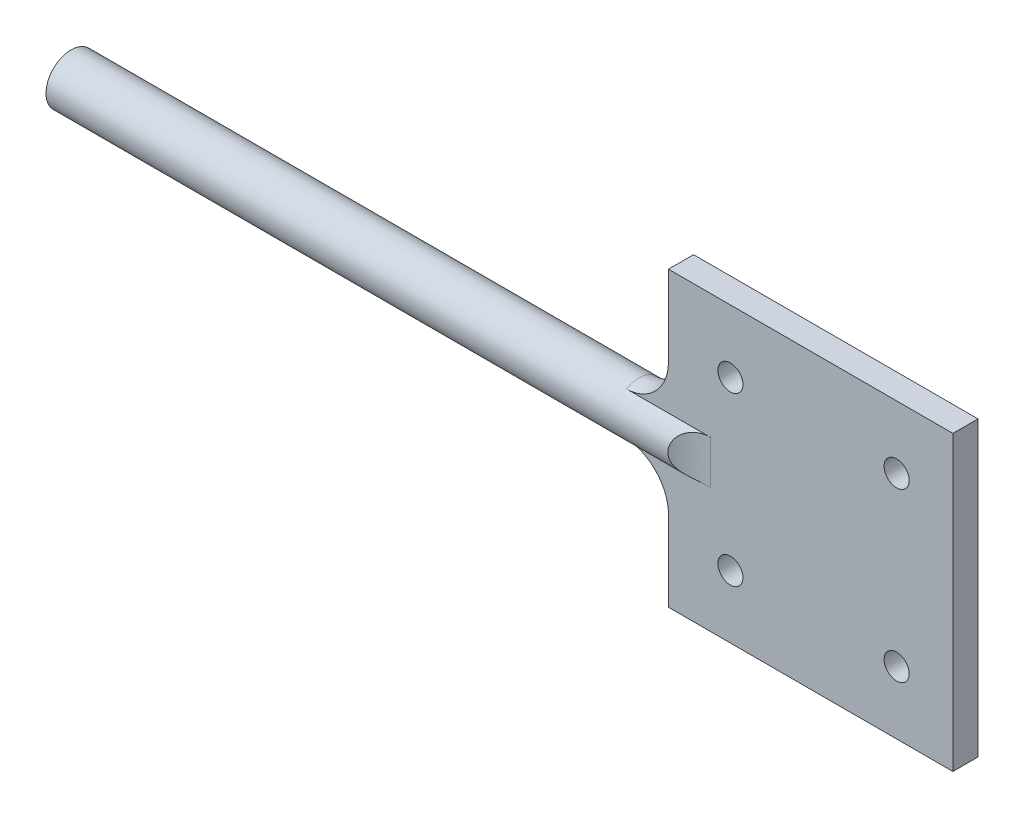
ISO-10303-21;
HEADER;
FILE_DESCRIPTION(('STEP AP214'),'2;1');
FILE_NAME('part.step','',(''),(''),'','','');
FILE_SCHEMA(('AUTOMOTIVE_DESIGN { 1 0 10303 214 1 1 1 1 }'));
ENDSEC;
DATA;
#1=APPLICATION_CONTEXT('core data for automotive mechanical design processes');
#2=APPLICATION_PROTOCOL_DEFINITION('international standard','automotive_design',2000,#1);
#3=PRODUCT_CONTEXT('',#1,'mechanical');
#4=PRODUCT('Part','Part','',(#3));
#5=PRODUCT_RELATED_PRODUCT_CATEGORY('part','',(#4));
#6=PRODUCT_DEFINITION_FORMATION('','',#4);
#7=PRODUCT_DEFINITION_CONTEXT('part definition',#1,'design');
#8=PRODUCT_DEFINITION('design','',#6,#7);
#9=PRODUCT_DEFINITION_SHAPE('','',#8);
#10=(LENGTH_UNIT() NAMED_UNIT(*) SI_UNIT(.MILLI.,.METRE.));
#11=(NAMED_UNIT(*) PLANE_ANGLE_UNIT() SI_UNIT($,.RADIAN.));
#12=(NAMED_UNIT(*) SI_UNIT($,.STERADIAN.) SOLID_ANGLE_UNIT());
#13=UNCERTAINTY_MEASURE_WITH_UNIT(LENGTH_MEASURE(1.E-05),#10,'distance_accuracy_value','');
#14=(GEOMETRIC_REPRESENTATION_CONTEXT(3) GLOBAL_UNCERTAINTY_ASSIGNED_CONTEXT((#13)) GLOBAL_UNIT_ASSIGNED_CONTEXT((#10,
#11,#12)) REPRESENTATION_CONTEXT('',''));
#15=CARTESIAN_POINT('',(0.,0.,0.));
#16=DIRECTION('',(0.,0.,1.));
#17=DIRECTION('',(1.,0.,0.));
#18=AXIS2_PLACEMENT_3D('',#15,#16,#17);
#19=CARTESIAN_POINT('',(-17.,-17.5,3.));
#20=DIRECTION('',(1.,0.,0.));
#21=DIRECTION('',(0.,0.,-1.));
#22=AXIS2_PLACEMENT_3D('',#19,#20,#21);
#23=PLANE('',#22);
#24=DIRECTION('',(0.,-1.,0.));
#25=VECTOR('',#24,1.);
#26=CARTESIAN_POINT('',(-17.,-17.5,0.));
#27=LINE('',#26,#25);
#28=CARTESIAN_POINT('',(-17.,17.5,0.));
#29=VERTEX_POINT('',#28);
#30=CARTESIAN_POINT('',(-17.,7.85811682275085,0.));
#31=VERTEX_POINT('',#30);
#32=EDGE_CURVE('E268',#29,#31,#27,.T.);
#33=ORIENTED_EDGE('',*,*,#32,.T.);
#34=CARTESIAN_POINT('',(-17.,0.,1.5));
#35=DIRECTION('',(1.,0.,0.));
#36=DIRECTION('',(0.,0.,-1.));
#37=AXIS2_PLACEMENT_3D('',#34,#35,#36);
#38=CIRCLE('',#37,8.);
#39=CARTESIAN_POINT('',(-17.,7.85811682275085,3.));
#40=VERTEX_POINT('',#39);
#41=EDGE_CURVE('E71',#31,#40,#38,.T.);
#42=ORIENTED_EDGE('',*,*,#41,.T.);
#43=DIRECTION('',(0.,-1.,0.));
#44=VECTOR('',#43,1.);
#45=CARTESIAN_POINT('',(-17.,-17.5,3.));
#46=LINE('',#45,#44);
#47=CARTESIAN_POINT('',(-17.,17.5,3.));
#48=VERTEX_POINT('',#47);
#49=EDGE_CURVE('E139',#48,#40,#46,.T.);
#50=ORIENTED_EDGE('',*,*,#49,.F.);
#51=DIRECTION('',(0.,0.,-1.));
#52=VECTOR('',#51,1.);
#53=CARTESIAN_POINT('',(-17.,17.5,3.));
#54=LINE('',#53,#52);
#55=EDGE_CURVE('E299',#48,#29,#54,.T.);
#56=ORIENTED_EDGE('',*,*,#55,.T.);
#57=EDGE_LOOP('',(#33,#42,#50,#56));
#58=FACE_BOUND('',#57,.T.);
#59=ADVANCED_FACE('F43',(#58),#23,.F.);
#60=CARTESIAN_POINT('',(-17.,-7.85811682275086,3.));
#61=VERTEX_POINT('',#60);
#62=CARTESIAN_POINT('',(-17.,-17.5,3.));
#63=VERTEX_POINT('',#62);
#64=EDGE_CURVE('E127',#61,#63,#46,.T.);
#65=ORIENTED_EDGE('',*,*,#64,.F.);
#66=CARTESIAN_POINT('',(-17.,0.,1.5));
#67=DIRECTION('',(1.,0.,0.));
#68=DIRECTION('',(0.,0.,-1.));
#69=AXIS2_PLACEMENT_3D('',#66,#67,#68);
#70=CIRCLE('',#69,8.);
#71=CARTESIAN_POINT('',(-17.,-7.85811682275086,0.));
#72=VERTEX_POINT('',#71);
#73=EDGE_CURVE('E510',#61,#72,#70,.T.);
#74=ORIENTED_EDGE('',*,*,#73,.T.);
#75=CARTESIAN_POINT('',(-17.,-17.5,0.));
#76=VERTEX_POINT('',#75);
#77=EDGE_CURVE('E154',#72,#76,#27,.T.);
#78=ORIENTED_EDGE('',*,*,#77,.T.);
#79=DIRECTION('',(0.,0.,-1.));
#80=VECTOR('',#79,1.);
#81=CARTESIAN_POINT('',(-17.,-17.5,3.));
#82=LINE('',#81,#80);
#83=EDGE_CURVE('E145',#63,#76,#82,.T.);
#84=ORIENTED_EDGE('',*,*,#83,.F.);
#85=EDGE_LOOP('',(#65,#74,#78,#84));
#86=FACE_BOUND('',#85,.T.);
#87=ADVANCED_FACE('F152',(#86),#23,.F.);
#88=CARTESIAN_POINT('',(17.,-17.5,3.));
#89=DIRECTION('',(0.,1.,0.));
#90=DIRECTION('',(0.,0.,1.));
#91=AXIS2_PLACEMENT_3D('',#88,#89,#90);
#92=PLANE('',#91);
#93=DIRECTION('',(1.,0.,0.));
#94=VECTOR('',#93,1.);
#95=CARTESIAN_POINT('',(17.,-17.5,0.));
#96=LINE('',#95,#94);
#97=CARTESIAN_POINT('',(17.,-17.5,0.));
#98=VERTEX_POINT('',#97);
#99=EDGE_CURVE('E302',#76,#98,#96,.T.);
#100=ORIENTED_EDGE('',*,*,#99,.T.);
#101=DIRECTION('',(0.,0.,-1.));
#102=VECTOR('',#101,1.);
#103=CARTESIAN_POINT('',(17.,-17.5,3.));
#104=LINE('',#103,#102);
#105=CARTESIAN_POINT('',(17.,-17.5,3.));
#106=VERTEX_POINT('',#105);
#107=EDGE_CURVE('E147',#106,#98,#104,.T.);
#108=ORIENTED_EDGE('',*,*,#107,.F.);
#109=DIRECTION('',(1.,0.,0.));
#110=VECTOR('',#109,1.);
#111=CARTESIAN_POINT('',(17.,-17.5,3.));
#112=LINE('',#111,#110);
#113=EDGE_CURVE('E131',#63,#106,#112,.T.);
#114=ORIENTED_EDGE('',*,*,#113,.F.);
#115=ORIENTED_EDGE('',*,*,#83,.T.);
#116=EDGE_LOOP('',(#100,#108,#114,#115));
#117=FACE_BOUND('',#116,.T.);
#118=ADVANCED_FACE('F144',(#117),#92,.F.);
#119=CARTESIAN_POINT('',(17.,-17.5,3.));
#120=DIRECTION('',(-1.,0.,0.));
#121=DIRECTION('',(0.,0.,1.));
#122=AXIS2_PLACEMENT_3D('',#119,#120,#121);
#123=PLANE('',#122);
#124=DIRECTION('',(0.,1.,0.));
#125=VECTOR('',#124,1.);
#126=CARTESIAN_POINT('',(17.,-17.5,0.));
#127=LINE('',#126,#125);
#128=CARTESIAN_POINT('',(17.,17.5,0.));
#129=VERTEX_POINT('',#128);
#130=EDGE_CURVE('E305',#98,#129,#127,.T.);
#131=ORIENTED_EDGE('',*,*,#130,.T.);
#132=DIRECTION('',(0.,0.,-1.));
#133=VECTOR('',#132,1.);
#134=CARTESIAN_POINT('',(17.,17.5,3.));
#135=LINE('',#134,#133);
#136=CARTESIAN_POINT('',(17.,17.5,3.));
#137=VERTEX_POINT('',#136);
#138=EDGE_CURVE('E164',#137,#129,#135,.T.);
#139=ORIENTED_EDGE('',*,*,#138,.F.);
#140=DIRECTION('',(0.,1.,0.));
#141=VECTOR('',#140,1.);
#142=CARTESIAN_POINT('',(17.,-17.5,3.));
#143=LINE('',#142,#141);
#144=EDGE_CURVE('E150',#106,#137,#143,.T.);
#145=ORIENTED_EDGE('',*,*,#144,.F.);
#146=ORIENTED_EDGE('',*,*,#107,.T.);
#147=EDGE_LOOP('',(#131,#139,#145,#146));
#148=FACE_BOUND('',#147,.T.);
#149=ADVANCED_FACE('F321',(#148),#123,.F.);
#150=CARTESIAN_POINT('',(17.,17.5,3.));
#151=DIRECTION('',(0.,-1.,0.));
#152=DIRECTION('',(1.,0.,0.));
#153=AXIS2_PLACEMENT_3D('',#150,#151,#152);
#154=PLANE('',#153);
#155=DIRECTION('',(-1.,0.,0.));
#156=VECTOR('',#155,1.);
#157=CARTESIAN_POINT('',(17.,17.5,0.));
#158=LINE('',#157,#156);
#159=EDGE_CURVE('E140',#129,#29,#158,.T.);
#160=ORIENTED_EDGE('',*,*,#159,.T.);
#161=ORIENTED_EDGE('',*,*,#55,.F.);
#162=DIRECTION('',(-1.,0.,0.));
#163=VECTOR('',#162,1.);
#164=CARTESIAN_POINT('',(17.,17.5,3.));
#165=LINE('',#164,#163);
#166=EDGE_CURVE('E297',#137,#48,#165,.T.);
#167=ORIENTED_EDGE('',*,*,#166,.F.);
#168=ORIENTED_EDGE('',*,*,#138,.T.);
#169=EDGE_LOOP('',(#160,#161,#167,#168));
#170=FACE_BOUND('',#169,.T.);
#171=ADVANCED_FACE('F242',(#170),#154,.F.);
#172=CARTESIAN_POINT('',(0.,0.,3.));
#173=DIRECTION('',(0.,0.,1.));
#174=DIRECTION('',(1.,0.,0.));
#175=AXIS2_PLACEMENT_3D('',#172,#173,#174);
#176=PLANE('',#175);
#177=CARTESIAN_POINT('',(10.2751582396487,-10.,3.));
#178=DIRECTION('',(0.,0.,1.));
#179=DIRECTION('',(1.,0.,0.));
#180=AXIS2_PLACEMENT_3D('',#177,#178,#179);
#181=CIRCLE('',#180,1.5);
#182=CARTESIAN_POINT('',(11.7751582396487,-10.,3.));
#183=VERTEX_POINT('',#182);
#184=EDGE_CURVE('E284',#183,#183,#181,.T.);
#185=ORIENTED_EDGE('',*,*,#184,.F.);
#186=EDGE_LOOP('',(#185));
#187=FACE_BOUND('',#186,.T.);
#188=CARTESIAN_POINT('',(-9.59363137479316,10.,3.));
#189=DIRECTION('',(0.,0.,1.));
#190=DIRECTION('',(1.,0.,0.));
#191=AXIS2_PLACEMENT_3D('',#188,#189,#190);
#192=CIRCLE('',#191,1.5);
#193=CARTESIAN_POINT('',(-8.09363137479316,10.,3.));
#194=VERTEX_POINT('',#193);
#195=EDGE_CURVE('E283',#194,#194,#192,.T.);
#196=ORIENTED_EDGE('',*,*,#195,.F.);
#197=EDGE_LOOP('',(#196));
#198=FACE_BOUND('',#197,.T.);
#199=CARTESIAN_POINT('',(-9.59363137479316,-10.,3.));
#200=DIRECTION('',(0.,0.,1.));
#201=DIRECTION('',(1.,0.,0.));
#202=AXIS2_PLACEMENT_3D('',#199,#200,#201);
#203=CIRCLE('',#202,1.5);
#204=CARTESIAN_POINT('',(-8.09363137479316,-10.,3.));
#205=VERTEX_POINT('',#204);
#206=EDGE_CURVE('E277',#205,#205,#203,.T.);
#207=ORIENTED_EDGE('',*,*,#206,.F.);
#208=EDGE_LOOP('',(#207));
#209=FACE_BOUND('',#208,.T.);
#210=CARTESIAN_POINT('',(10.2751582396487,10.,3.));
#211=DIRECTION('',(0.,0.,1.));
#212=DIRECTION('',(1.,0.,0.));
#213=AXIS2_PLACEMENT_3D('',#210,#211,#212);
#214=CIRCLE('',#213,1.5);
#215=CARTESIAN_POINT('',(11.7751582396487,10.,3.));
#216=VERTEX_POINT('',#215);
#217=EDGE_CURVE('E173',#216,#216,#214,.T.);
#218=ORIENTED_EDGE('',*,*,#217,.F.);
#219=EDGE_LOOP('',(#218));
#220=FACE_BOUND('',#219,.T.);
#221=DIRECTION('',(0.,-1.,0.));
#222=VECTOR('',#221,1.);
#223=CARTESIAN_POINT('',(-12.,0.,3.));
#224=LINE('',#223,#222);
#225=CARTESIAN_POINT('',(-12.,2.59807621135331,3.));
#226=VERTEX_POINT('',#225);
#227=CARTESIAN_POINT('',(-12.,-2.59807621135332,3.));
#228=VERTEX_POINT('',#227);
#229=EDGE_CURVE('E162',#226,#228,#224,.T.);
#230=ORIENTED_EDGE('',*,*,#229,.T.);
#231=DIRECTION('',(1.,0.,0.));
#232=VECTOR('',#231,1.);
#233=CARTESIAN_POINT('',(-12.,-2.59807621135332,3.));
#234=LINE('',#233,#232);
#235=CARTESIAN_POINT('',(-22.,-2.59807621135332,3.));
#236=VERTEX_POINT('',#235);
#237=EDGE_CURVE('E187',#228,#236,#234,.F.);
#238=ORIENTED_EDGE('',*,*,#237,.T.);
#239=CARTESIAN_POINT('',(-22.,-2.59807621135332,3.));
#240=CARTESIAN_POINT('',(-21.8720698590303,-2.59803434740894,3.));
#241=CARTESIAN_POINT('',(-21.7441631751176,-2.60374465449356,3.));
#242=CARTESIAN_POINT('',(-21.4894223234853,-2.62634318554361,3.));
#243=CARTESIAN_POINT('',(-21.3625875068187,-2.64322406915488,3.));
#244=CARTESIAN_POINT('',(-21.111494918928,-2.68772303440085,3.));
#245=CARTESIAN_POINT('',(-20.9872272285358,-2.71528527410251,3.));
#246=CARTESIAN_POINT('',(-20.741417959479,-2.78059800674806,3.));
#247=CARTESIAN_POINT('',(-20.6198767532492,-2.81834988251672,3.));
#248=CARTESIAN_POINT('',(-20.2636899311158,-2.94483774866838,3.));
#249=CARTESIAN_POINT('',(-20.0338478031004,-3.0474791503028,3.));
#250=CARTESIAN_POINT('',(-19.5916089121233,-3.28547979991975,3.));
#251=CARTESIAN_POINT('',(-19.3792405625467,-3.4208909776313,3.));
#252=CARTESIAN_POINT('',(-18.9490802535146,-3.74000694258217,3.));
#253=CARTESIAN_POINT('',(-18.7342499521256,-3.92772141278141,3.));
#254=CARTESIAN_POINT('',(-18.3365480794698,-4.33433574809454,3.));
#255=CARTESIAN_POINT('',(-18.1536795911206,-4.55323861783318,3.));
#256=CARTESIAN_POINT('',(-17.8126350868577,-5.03347099287463,3.));
#257=CARTESIAN_POINT('',(-17.6571355232553,-5.29670962363604,3.));
#258=CARTESIAN_POINT('',(-17.3929512931485,-5.8456561761937,3.));
#259=CARTESIAN_POINT('',(-17.284249140203,-6.13135565793577,3.));
#260=CARTESIAN_POINT('',(-17.1345640613075,-6.65712661584011,3.));
#261=CARTESIAN_POINT('',(-17.0842746390812,-6.89456914177847,3.));
#262=CARTESIAN_POINT('',(-17.033811477544,-7.25409583755924,3.));
#263=CARTESIAN_POINT('',(-17.0211522202324,-7.37452245629507,3.));
#264=CARTESIAN_POINT('',(-17.0042444352086,-7.61599309212197,3.));
#265=CARTESIAN_POINT('',(-16.9999979177925,-7.73703724985304,3.));
#266=CARTESIAN_POINT('',(-17.,-7.85811682275086,3.));
#267=B_SPLINE_CURVE_WITH_KNOTS('',3,(#239,#240,#241,#242,#243,#244,#245,#246,#247,#248,#249,
#250,#251,#252,#253,#254,#255,#256,#257,#258,#259,#260,#261,#262,#263,#264,#265,#266),
.UNSPECIFIED.,.F.,.F.,(4,2,2,2,2,2,2,2,2,2,2,2,2,4),(0.,0.383624660063179,0.766997484577274,
1.14839250840167,1.52983931698956,2.28177594498336,3.03491204855058,3.88712341820064,
4.73941694368307,5.65224764636578,6.5647369617,7.29047044826544,7.65347933390575,
8.01657495317183),.UNSPECIFIED.);
#268=EDGE_CURVE('E134',#236,#61,#267,.T.);
#269=ORIENTED_EDGE('',*,*,#268,.T.);
#270=ORIENTED_EDGE('',*,*,#64,.T.);
#271=ORIENTED_EDGE('',*,*,#113,.T.);
#272=ORIENTED_EDGE('',*,*,#144,.T.);
#273=ORIENTED_EDGE('',*,*,#166,.T.);
#274=ORIENTED_EDGE('',*,*,#49,.T.);
#275=CARTESIAN_POINT('',(-17.,7.85811682275085,3.));
#276=CARTESIAN_POINT('',(-16.9999692987539,7.68674663597396,3.));
#277=CARTESIAN_POINT('',(-17.0084987547938,7.51539417475878,3.));
#278=CARTESIAN_POINT('',(-17.0423349389988,7.17437917110647,3.));
#279=CARTESIAN_POINT('',(-17.0676389233026,7.00471635689479,3.));
#280=CARTESIAN_POINT('',(-17.1345521257779,6.66932563818923,3.));
#281=CARTESIAN_POINT('',(-17.1760981188457,6.50358508719419,3.));
#282=CARTESIAN_POINT('',(-17.2749638644063,6.17689508819653,3.));
#283=CARTESIAN_POINT('',(-17.3322817440143,6.01594507383898,3.));
#284=CARTESIAN_POINT('',(-17.4533133841518,5.72147277648576,3.));
#285=CARTESIAN_POINT('',(-17.5151360388739,5.58716870892895,3.));
#286=CARTESIAN_POINT('',(-17.6496307681134,5.3240529879333,3.));
#287=CARTESIAN_POINT('',(-17.7223062152858,5.19524305792816,3.));
#288=CARTESIAN_POINT('',(-17.8779306543871,4.94401715956082,3.));
#289=CARTESIAN_POINT('',(-17.9608774520166,4.82159983344502,3.));
#290=CARTESIAN_POINT('',(-18.1364618110889,4.58390504733365,3.));
#291=CARTESIAN_POINT('',(-18.2291027312913,4.46863008415093,3.));
#292=CARTESIAN_POINT('',(-18.5261978572783,4.12832184932962,3.));
#293=CARTESIAN_POINT('',(-18.7454356631702,3.91590555653528,3.));
#294=CARTESIAN_POINT('',(-19.2169276752085,3.53088339046573,3.));
#295=CARTESIAN_POINT('',(-19.4692114797099,3.35831359400286,3.));
#296=CARTESIAN_POINT('',(-19.8663163380417,3.13552120118883,3.));
#297=CARTESIAN_POINT('',(-20.0013323135264,3.06742975519197,3.));
#298=CARTESIAN_POINT('',(-20.2771016277977,2.94385640314973,3.));
#299=CARTESIAN_POINT('',(-20.4178558585296,2.88837646629814,3.));
#300=CARTESIAN_POINT('',(-20.7035901548799,2.79126117307103,3.));
#301=CARTESIAN_POINT('',(-20.848556116077,2.74958435598486,3.));
#302=CARTESIAN_POINT('',(-21.1418407861391,2.68085691162363,3.));
#303=CARTESIAN_POINT('',(-21.2901568030171,2.6537949474758,3.));
#304=CARTESIAN_POINT('',(-21.5323822775267,2.62234428767057,3.));
#305=CARTESIAN_POINT('',(-21.6257030262999,2.61325327456877,3.));
#306=CARTESIAN_POINT('',(-21.8126764213394,2.60111621575852,3.));
#307=CARTESIAN_POINT('',(-21.9063288183948,2.59806632409141,3.));
#308=CARTESIAN_POINT('',(-22.,2.59807621135331,3.));
#309=B_SPLINE_CURVE_WITH_KNOTS('',3,(#275,#276,#277,#278,#279,#280,#281,#282,#283,#284,#285,
#286,#287,#288,#289,#290,#291,#292,#293,#294,#295,#296,#297,#298,#299,#300,#301,#302,#303,#304,
#305,#306,#307,#308),.UNSPECIFIED.,.F.,.F.,(4,2,2,2,2,2,2,2,2,2,2,2,2,2,2,2,4),(0.,
0.513873121658802,1.0276622082409,1.53947087503994,2.05121879163288,2.49427829149356,
2.93747576584295,3.38057872141019,3.82383571208794,4.73508750304379,5.64716112955732,
6.10028247256415,6.55347451858926,7.00529268859908,7.45675987393371,7.73786703079971,
8.01879516884617),.UNSPECIFIED.);
#310=CARTESIAN_POINT('',(-22.,2.59807621135331,3.));
#311=VERTEX_POINT('',#310);
#312=EDGE_CURVE('E11',#40,#311,#309,.T.);
#313=ORIENTED_EDGE('',*,*,#312,.T.);
#314=DIRECTION('',(1.,0.,0.));
#315=VECTOR('',#314,1.);
#316=CARTESIAN_POINT('',(-17.,2.59807621135331,3.));
#317=LINE('',#316,#315);
#318=EDGE_CURVE('E157',#311,#226,#317,.T.);
#319=ORIENTED_EDGE('',*,*,#318,.T.);
#320=EDGE_LOOP('',(#230,#238,#269,#270,#271,#272,#273,#274,#313,#319));
#321=FACE_BOUND('',#320,.T.);
#322=ADVANCED_FACE('F130',(#187,#198,#209,#220,#321),#176,.T.);
#323=CARTESIAN_POINT('',(0.,0.,0.));
#324=DIRECTION('',(0.,0.,1.));
#325=DIRECTION('',(1.,0.,0.));
#326=AXIS2_PLACEMENT_3D('',#323,#324,#325);
#327=PLANE('',#326);
#328=CARTESIAN_POINT('',(10.2751582396487,-10.,0.));
#329=DIRECTION('',(0.,0.,1.));
#330=DIRECTION('',(1.,0.,0.));
#331=AXIS2_PLACEMENT_3D('',#328,#329,#330);
#332=CIRCLE('',#331,1.5);
#333=CARTESIAN_POINT('',(11.7751582396487,-10.,0.));
#334=VERTEX_POINT('',#333);
#335=EDGE_CURVE('E181',#334,#334,#332,.T.);
#336=ORIENTED_EDGE('',*,*,#335,.T.);
#337=EDGE_LOOP('',(#336));
#338=FACE_BOUND('',#337,.T.);
#339=CARTESIAN_POINT('',(-9.59363137479316,10.,0.));
#340=DIRECTION('',(0.,0.,1.));
#341=DIRECTION('',(1.,0.,0.));
#342=AXIS2_PLACEMENT_3D('',#339,#340,#341);
#343=CIRCLE('',#342,1.5);
#344=CARTESIAN_POINT('',(-8.09363137479316,10.,0.));
#345=VERTEX_POINT('',#344);
#346=EDGE_CURVE('E177',#345,#345,#343,.T.);
#347=ORIENTED_EDGE('',*,*,#346,.T.);
#348=EDGE_LOOP('',(#347));
#349=FACE_BOUND('',#348,.T.);
#350=CARTESIAN_POINT('',(-9.59363137479316,-10.,0.));
#351=DIRECTION('',(0.,0.,1.));
#352=DIRECTION('',(1.,0.,0.));
#353=AXIS2_PLACEMENT_3D('',#350,#351,#352);
#354=CIRCLE('',#353,1.5);
#355=CARTESIAN_POINT('',(-8.09363137479316,-10.,0.));
#356=VERTEX_POINT('',#355);
#357=EDGE_CURVE('E172',#356,#356,#354,.T.);
#358=ORIENTED_EDGE('',*,*,#357,.T.);
#359=EDGE_LOOP('',(#358));
#360=FACE_BOUND('',#359,.T.);
#361=CARTESIAN_POINT('',(10.2751582396487,10.,0.));
#362=DIRECTION('',(0.,0.,1.));
#363=DIRECTION('',(1.,0.,0.));
#364=AXIS2_PLACEMENT_3D('',#361,#362,#363);
#365=CIRCLE('',#364,1.5);
#366=CARTESIAN_POINT('',(11.7751582396487,10.,0.));
#367=VERTEX_POINT('',#366);
#368=EDGE_CURVE('E168',#367,#367,#365,.T.);
#369=ORIENTED_EDGE('',*,*,#368,.T.);
#370=EDGE_LOOP('',(#369));
#371=FACE_BOUND('',#370,.T.);
#372=ORIENTED_EDGE('',*,*,#32,.F.);
#373=ORIENTED_EDGE('',*,*,#159,.F.);
#374=ORIENTED_EDGE('',*,*,#130,.F.);
#375=ORIENTED_EDGE('',*,*,#99,.F.);
#376=ORIENTED_EDGE('',*,*,#77,.F.);
#377=CARTESIAN_POINT('',(-17.,-7.85811682275086,0.));
#378=CARTESIAN_POINT('',(-16.9999692987539,-7.68674663597397,0.));
#379=CARTESIAN_POINT('',(-17.0084987547938,-7.51539417475878,0.));
#380=CARTESIAN_POINT('',(-17.0423349389988,-7.17437917110648,0.));
#381=CARTESIAN_POINT('',(-17.0676389233026,-7.0047163568948,0.));
#382=CARTESIAN_POINT('',(-17.1345521257779,-6.66932563818924,0.));
#383=CARTESIAN_POINT('',(-17.1760981188457,-6.5035850871942,0.));
#384=CARTESIAN_POINT('',(-17.2749638644063,-6.17689508819653,0.));
#385=CARTESIAN_POINT('',(-17.3322817440143,-6.01594507383899,0.));
#386=CARTESIAN_POINT('',(-17.4533133841518,-5.72147277648577,0.));
#387=CARTESIAN_POINT('',(-17.5151360388739,-5.58716870892896,0.));
#388=CARTESIAN_POINT('',(-17.6496307681134,-5.32405298793331,0.));
#389=CARTESIAN_POINT('',(-17.7223062152858,-5.19524305792817,0.));
#390=CARTESIAN_POINT('',(-17.8779306543871,-4.94401715956083,0.));
#391=CARTESIAN_POINT('',(-17.9608774520166,-4.82159983344502,0.));
#392=CARTESIAN_POINT('',(-18.1364618110889,-4.58390504733366,0.));
#393=CARTESIAN_POINT('',(-18.2291027312913,-4.46863008415093,0.));
#394=CARTESIAN_POINT('',(-18.5261978572783,-4.12832184932962,0.));
#395=CARTESIAN_POINT('',(-18.7454356631702,-3.91590555653528,0.));
#396=CARTESIAN_POINT('',(-19.2169276752085,-3.53088339046573,0.));
#397=CARTESIAN_POINT('',(-19.4692114797099,-3.35831359400286,0.));
#398=CARTESIAN_POINT('',(-19.8663163380417,-3.13552120118884,0.));
#399=CARTESIAN_POINT('',(-20.0013323135264,-3.06742975519197,0.));
#400=CARTESIAN_POINT('',(-20.2771016277977,-2.94385640314973,0.));
#401=CARTESIAN_POINT('',(-20.4178558585296,-2.88837646629814,0.));
#402=CARTESIAN_POINT('',(-20.7035901548799,-2.79126117307104,0.));
#403=CARTESIAN_POINT('',(-20.848556116077,-2.74958435598487,0.));
#404=CARTESIAN_POINT('',(-21.1418407861391,-2.68085691162364,0.));
#405=CARTESIAN_POINT('',(-21.2901568030171,-2.65379494747581,0.));
#406=CARTESIAN_POINT('',(-21.5323822775267,-2.62234428767057,0.));
#407=CARTESIAN_POINT('',(-21.6257030262999,-2.61325327456878,0.));
#408=CARTESIAN_POINT('',(-21.8126764213394,-2.60111621575853,0.));
#409=CARTESIAN_POINT('',(-21.9063288183948,-2.59806632409142,0.));
#410=CARTESIAN_POINT('',(-22.,-2.59807621135332,0.));
#411=B_SPLINE_CURVE_WITH_KNOTS('',3,(#377,#378,#379,#380,#381,#382,#383,#384,#385,#386,#387,
#388,#389,#390,#391,#392,#393,#394,#395,#396,#397,#398,#399,#400,#401,#402,#403,#404,#405,#406,
#407,#408,#409,#410),.UNSPECIFIED.,.F.,.F.,(4,2,2,2,2,2,2,2,2,2,2,2,2,2,2,2,4),(0.,
0.513873121658802,1.0276622082409,1.53947087503994,2.05121879163288,2.49427829149356,
2.93747576584295,3.38057872141019,3.82383571208794,4.73508750304379,5.64716112955732,
6.10028247256415,6.55347451858926,7.00529268859908,7.45675987393371,7.73786703079971,
8.01879516884617),.UNSPECIFIED.);
#412=CARTESIAN_POINT('',(-22.,-2.59807621135332,0.));
#413=VERTEX_POINT('',#412);
#414=EDGE_CURVE('E224',#72,#413,#411,.T.);
#415=ORIENTED_EDGE('',*,*,#414,.T.);
#416=DIRECTION('',(1.,0.,0.));
#417=VECTOR('',#416,1.);
#418=CARTESIAN_POINT('',(-17.,-2.59807621135332,0.));
#419=LINE('',#418,#417);
#420=CARTESIAN_POINT('',(-17.,-2.59807621135332,0.));
#421=VERTEX_POINT('',#420);
#422=EDGE_CURVE('E199',#421,#413,#419,.F.);
#423=ORIENTED_EDGE('',*,*,#422,.F.);
#424=CARTESIAN_POINT('',(-17.,2.59807621135331,0.));
#425=VERTEX_POINT('',#424);
#426=EDGE_CURVE('E263',#425,#421,#27,.T.);
#427=ORIENTED_EDGE('',*,*,#426,.F.);
#428=DIRECTION('',(1.,0.,0.));
#429=VECTOR('',#428,1.);
#430=CARTESIAN_POINT('',(-22.,2.59807621135331,0.));
#431=LINE('',#430,#429);
#432=CARTESIAN_POINT('',(-22.,2.59807621135331,0.));
#433=VERTEX_POINT('',#432);
#434=EDGE_CURVE('E252',#433,#425,#431,.T.);
#435=ORIENTED_EDGE('',*,*,#434,.F.);
#436=CARTESIAN_POINT('',(-22.,2.59807621135331,0.));
#437=CARTESIAN_POINT('',(-21.8720698590303,2.59803434740894,0.));
#438=CARTESIAN_POINT('',(-21.7441631751176,2.60374465449355,0.));
#439=CARTESIAN_POINT('',(-21.4894223234853,2.6263431855436,0.));
#440=CARTESIAN_POINT('',(-21.3625875068187,2.64322406915488,0.));
#441=CARTESIAN_POINT('',(-21.111494918928,2.68772303440084,0.));
#442=CARTESIAN_POINT('',(-20.9872272285358,2.71528527410251,0.));
#443=CARTESIAN_POINT('',(-20.741417959479,2.78059800674805,0.));
#444=CARTESIAN_POINT('',(-20.6198767532492,2.81834988251671,0.));
#445=CARTESIAN_POINT('',(-20.2636899311158,2.94483774866837,0.));
#446=CARTESIAN_POINT('',(-20.0338478031004,3.0474791503028,0.));
#447=CARTESIAN_POINT('',(-19.5916089121233,3.28547979991974,0.));
#448=CARTESIAN_POINT('',(-19.3792405625467,3.4208909776313,0.));
#449=CARTESIAN_POINT('',(-18.9490802535146,3.74000694258216,0.));
#450=CARTESIAN_POINT('',(-18.7342499521256,3.9277214127814,0.));
#451=CARTESIAN_POINT('',(-18.3365480794698,4.33433574809454,0.));
#452=CARTESIAN_POINT('',(-18.1536795911206,4.55323861783317,0.));
#453=CARTESIAN_POINT('',(-17.8126350868577,5.03347099287462,0.));
#454=CARTESIAN_POINT('',(-17.6571355232553,5.29670962363603,0.));
#455=CARTESIAN_POINT('',(-17.3929512931485,5.84565617619369,0.));
#456=CARTESIAN_POINT('',(-17.284249140203,6.13135565793577,0.));
#457=CARTESIAN_POINT('',(-17.1345640613075,6.6571266158401,0.));
#458=CARTESIAN_POINT('',(-17.0842746390812,6.89456914177846,0.));
#459=CARTESIAN_POINT('',(-17.033811477544,7.25409583755923,0.));
#460=CARTESIAN_POINT('',(-17.0211522202324,7.37452245629506,0.));
#461=CARTESIAN_POINT('',(-17.0042444352086,7.61599309212197,0.));
#462=CARTESIAN_POINT('',(-16.9999979177925,7.73703724985303,0.));
#463=CARTESIAN_POINT('',(-17.,7.85811682275085,0.));
#464=B_SPLINE_CURVE_WITH_KNOTS('',3,(#436,#437,#438,#439,#440,#441,#442,#443,#444,#445,#446,
#447,#448,#449,#450,#451,#452,#453,#454,#455,#456,#457,#458,#459,#460,#461,#462,#463),
.UNSPECIFIED.,.F.,.F.,(4,2,2,2,2,2,2,2,2,2,2,2,2,4),(0.,0.383624660063179,0.766997484577274,
1.14839250840167,1.52983931698956,2.28177594498336,3.03491204855058,3.88712341820064,
4.73941694368307,5.65224764636578,6.5647369617,7.29047044826544,7.65347933390575,
8.01657495317183),.UNSPECIFIED.);
#465=EDGE_CURVE('E58',#433,#31,#464,.T.);
#466=ORIENTED_EDGE('',*,*,#465,.T.);
#467=EDGE_LOOP('',(#372,#373,#374,#375,#376,#415,#423,#427,#435,#466));
#468=FACE_BOUND('',#467,.T.);
#469=ADVANCED_FACE('F234',(#338,#349,#360,#371,#468),#327,.F.);
#470=CARTESIAN_POINT('',(10.2751582396487,10.,-7.));
#471=DIRECTION('',(0.,0.,1.));
#472=DIRECTION('',(1.,0.,0.));
#473=AXIS2_PLACEMENT_3D('',#470,#471,#472);
#474=CYLINDRICAL_SURFACE('',#473,1.5);
#475=ORIENTED_EDGE('',*,*,#217,.T.);
#476=EDGE_LOOP('',(#475));
#477=FACE_BOUND('',#476,.T.);
#478=ORIENTED_EDGE('',*,*,#368,.F.);
#479=EDGE_LOOP('',(#478));
#480=FACE_BOUND('',#479,.T.);
#481=ADVANCED_FACE('F238',(#477,#480),#474,.F.);
#482=CARTESIAN_POINT('',(-9.59363137479316,-10.,-7.));
#483=DIRECTION('',(0.,0.,1.));
#484=DIRECTION('',(1.,0.,0.));
#485=AXIS2_PLACEMENT_3D('',#482,#483,#484);
#486=CYLINDRICAL_SURFACE('',#485,1.5);
#487=ORIENTED_EDGE('',*,*,#206,.T.);
#488=EDGE_LOOP('',(#487));
#489=FACE_BOUND('',#488,.T.);
#490=ORIENTED_EDGE('',*,*,#357,.F.);
#491=EDGE_LOOP('',(#490));
#492=FACE_BOUND('',#491,.T.);
#493=ADVANCED_FACE('F397',(#489,#492),#486,.F.);
#494=CARTESIAN_POINT('',(-9.59363137479316,10.,-7.));
#495=DIRECTION('',(0.,0.,1.));
#496=DIRECTION('',(1.,0.,0.));
#497=AXIS2_PLACEMENT_3D('',#494,#495,#496);
#498=CYLINDRICAL_SURFACE('',#497,1.5);
#499=ORIENTED_EDGE('',*,*,#195,.T.);
#500=EDGE_LOOP('',(#499));
#501=FACE_BOUND('',#500,.T.);
#502=ORIENTED_EDGE('',*,*,#346,.F.);
#503=EDGE_LOOP('',(#502));
#504=FACE_BOUND('',#503,.T.);
#505=ADVANCED_FACE('F407',(#501,#504),#498,.F.);
#506=CARTESIAN_POINT('',(10.2751582396487,-10.,-7.));
#507=DIRECTION('',(0.,0.,1.));
#508=DIRECTION('',(1.,0.,0.));
#509=AXIS2_PLACEMENT_3D('',#506,#507,#508);
#510=CYLINDRICAL_SURFACE('',#509,1.5);
#511=ORIENTED_EDGE('',*,*,#184,.T.);
#512=EDGE_LOOP('',(#511));
#513=FACE_BOUND('',#512,.T.);
#514=ORIENTED_EDGE('',*,*,#335,.F.);
#515=EDGE_LOOP('',(#514));
#516=FACE_BOUND('',#515,.T.);
#517=ADVANCED_FACE('F417',(#513,#516),#510,.F.);
#518=CARTESIAN_POINT('',(-17.,0.,1.5));
#519=DIRECTION('',(-1.,0.,0.));
#520=DIRECTION('',(0.,0.,1.));
#521=AXIS2_PLACEMENT_3D('',#518,#519,#520);
#522=PLANE('',#521);
#523=CARTESIAN_POINT('',(-17.,0.,1.5));
#524=DIRECTION('',(-1.,0.,0.));
#525=DIRECTION('',(0.,0.,1.));
#526=AXIS2_PLACEMENT_3D('',#523,#524,#525);
#527=CIRCLE('',#526,3.);
#528=EDGE_CURVE('E270',#425,#421,#527,.T.);
#529=ORIENTED_EDGE('',*,*,#528,.F.);
#530=ORIENTED_EDGE('',*,*,#426,.T.);
#531=EDGE_LOOP('',(#529,#530));
#532=FACE_BOUND('',#531,.T.);
#533=ADVANCED_FACE('F271',(#532),#522,.F.);
#534=CARTESIAN_POINT('',(-89.9,0.,1.5));
#535=DIRECTION('',(1.,0.,0.));
#536=DIRECTION('',(0.,0.,-1.));
#537=AXIS2_PLACEMENT_3D('',#534,#535,#536);
#538=CYLINDRICAL_SURFACE('',#537,3.);
#539=CARTESIAN_POINT('',(-89.9,0.,1.5));
#540=DIRECTION('',(-1.,0.,0.));
#541=DIRECTION('',(0.,0.,1.));
#542=AXIS2_PLACEMENT_3D('',#539,#540,#541);
#543=CIRCLE('',#542,3.);
#544=CARTESIAN_POINT('',(-89.9,0.,4.5));
#545=VERTEX_POINT('',#544);
#546=EDGE_CURVE('E273',#545,#545,#543,.T.);
#547=ORIENTED_EDGE('',*,*,#546,.F.);
#548=EDGE_LOOP('',(#547));
#549=FACE_BOUND('',#548,.T.);
#550=CARTESIAN_POINT('',(-22.,0.,1.5));
#551=DIRECTION('',(1.,0.,0.));
#552=DIRECTION('',(0.,0.,-1.));
#553=AXIS2_PLACEMENT_3D('',#550,#551,#552);
#554=CIRCLE('',#553,3.);
#555=EDGE_CURVE('E232',#311,#433,#554,.F.);
#556=ORIENTED_EDGE('',*,*,#555,.T.);
#557=ORIENTED_EDGE('',*,*,#434,.T.);
#558=ORIENTED_EDGE('',*,*,#528,.T.);
#559=ORIENTED_EDGE('',*,*,#422,.T.);
#560=CARTESIAN_POINT('',(-22.,0.,1.5));
#561=DIRECTION('',(1.,0.,0.));
#562=DIRECTION('',(0.,0.,-1.));
#563=AXIS2_PLACEMENT_3D('',#560,#561,#562);
#564=CIRCLE('',#563,3.);
#565=EDGE_CURVE('E508',#413,#236,#564,.F.);
#566=ORIENTED_EDGE('',*,*,#565,.T.);
#567=ORIENTED_EDGE('',*,*,#237,.F.);
#568=CARTESIAN_POINT('',(-12.,-2.59807621135332,3.));
#569=CARTESIAN_POINT('',(-12.0636256243691,-2.59807283172224,2.99999967630973));
#570=CARTESIAN_POINT('',(-12.1272426885263,-2.59737534820762,3.00121478026822));
#571=CARTESIAN_POINT('',(-12.2543541151891,-2.59456515613869,3.0060686781988));
#572=CARTESIAN_POINT('',(-12.3178484753074,-2.5924524203227,3.00970751885877));
#573=CARTESIAN_POINT('',(-12.5080983703279,-2.58394579713242,3.02425746365447));
#574=CARTESIAN_POINT('',(-12.6345069690061,-2.57538340151316,3.0388019694));
#575=CARTESIAN_POINT('',(-12.8861326516201,-2.55186882471387,3.07749143817608));
#576=CARTESIAN_POINT('',(-13.0113355006324,-2.53687297201248,3.10170193639562));
#577=CARTESIAN_POINT('',(-13.2584562818296,-2.49957951419244,3.15930195033689));
#578=CARTESIAN_POINT('',(-13.380376215049,-2.47728647119976,3.19268572893295));
#579=CARTESIAN_POINT('',(-13.5864061499018,-2.43153749610008,3.2574762593507));
#580=CARTESIAN_POINT('',(-13.6716143071429,-2.41012346336763,3.28685782667698));
#581=CARTESIAN_POINT('',(-13.8390804252685,-2.36227898464861,3.34964803392495));
#582=CARTESIAN_POINT('',(-13.9213390784293,-2.33584972506825,3.3830557207438));
#583=CARTESIAN_POINT('',(-14.0820241670449,-2.27746475983071,3.45326145803811));
#584=CARTESIAN_POINT('',(-14.1604626752521,-2.24552813936528,3.4900476015806));
#585=CARTESIAN_POINT('',(-14.3130923558982,-2.17547996151318,3.56639016751154));
#586=CARTESIAN_POINT('',(-14.3872844246002,-2.13736971369876,3.60594600137509));
#587=CARTESIAN_POINT('',(-14.5733729322437,-2.02971208347343,3.71106972284893));
#588=CARTESIAN_POINT('',(-14.681493282593,-1.95493629819671,3.77813418966022));
#589=CARTESIAN_POINT('',(-14.8820632506422,-1.78654370913569,3.9124230674186));
#590=CARTESIAN_POINT('',(-14.9745157906995,-1.69293042605918,3.97964744616173));
#591=CARTESIAN_POINT('',(-15.0996113721009,-1.53828532110195,4.07632163207777));
#592=CARTESIAN_POINT('',(-15.1391813367539,-1.48411171135194,4.10797498781563));
#593=CARTESIAN_POINT('',(-15.2133831800453,-1.37130494778357,4.16901238289194));
#594=CARTESIAN_POINT('',(-15.2480174407113,-1.31267396623842,4.19839751374178));
#595=CARTESIAN_POINT('',(-15.3121631003043,-1.19126692875303,4.25415051385419));
#596=CARTESIAN_POINT('',(-15.3416719673893,-1.12848884524271,4.28051688973282));
#597=CARTESIAN_POINT('',(-15.3954047837185,-0.999343353884127,4.32950362087602));
#598=CARTESIAN_POINT('',(-15.4196296508006,-0.932976571900883,4.35212462655171));
#599=CARTESIAN_POINT('',(-15.4787862150968,-0.746603143706428,4.40823595718292));
#600=CARTESIAN_POINT('',(-15.5082650131892,-0.623441659755639,4.43728301993875));
#601=CARTESIAN_POINT('',(-15.5507037326844,-0.371968461413499,4.47957077793793));
#602=CARTESIAN_POINT('',(-15.5637082805281,-0.24367163596517,4.49285416856));
#603=CARTESIAN_POINT('',(-15.5698488595022,-0.0805348777452515,4.49911844427143));
#604=CARTESIAN_POINT('',(-15.5705610222233,-0.0460895153994567,4.49984374650158));
#605=CARTESIAN_POINT('',(-15.5708231407741,0.0228103763432153,4.50011109346895));
#606=CARTESIAN_POINT('',(-15.5703730891203,0.0572649057976908,4.49965313058717));
#607=CARTESIAN_POINT('',(-15.5655962150796,0.216430928305536,4.49477698357537));
#608=CARTESIAN_POINT('',(-15.554197888348,0.340885664941526,4.48312285824187));
#609=CARTESIAN_POINT('',(-15.5160288317755,0.585254130218827,4.44496834467843));
#610=CARTESIAN_POINT('',(-15.4892230925651,0.705156851879514,4.41843414868105));
#611=CARTESIAN_POINT('',(-15.4203571527336,0.93647901272532,4.35261703914627));
#612=CARTESIAN_POINT('',(-15.3783325359217,1.04791751310925,4.31336388661364));
#613=CARTESIAN_POINT('',(-15.2794470604733,1.25968065180538,4.22513687588059));
#614=CARTESIAN_POINT('',(-15.222593819061,1.36001095863295,4.17616801156553));
#615=CARTESIAN_POINT('',(-15.0941446079431,1.5489569377739,4.07148936678324));
#616=CARTESIAN_POINT('',(-15.0223702365053,1.63740728832776,4.01570173478098));
#617=CARTESIAN_POINT('',(-14.8660333300999,1.80034360564968,3.90180462555474));
#618=CARTESIAN_POINT('',(-14.7814668126498,1.87482520740138,3.84369442942418));
#619=CARTESIAN_POINT('',(-14.5906155156178,2.01829441847145,3.72179964648467));
#620=CARTESIAN_POINT('',(-14.4829426027857,2.0855550850142,3.65816919669205));
#621=CARTESIAN_POINT('',(-14.2565550872178,2.20470454249336,3.5363119837551));
#622=CARTESIAN_POINT('',(-14.1378302219299,2.25657885517091,3.47809034534661));
#623=CARTESIAN_POINT('',(-13.9229548332407,2.33566465559863,3.38346656433497));
#624=CARTESIAN_POINT('',(-13.8286393940808,2.36579756426029,3.34526005456525));
#625=CARTESIAN_POINT('',(-13.6361794272532,2.41956576296604,3.27417330310081));
#626=CARTESIAN_POINT('',(-13.5380332538853,2.44319822451154,3.24129538254947));
#627=CARTESIAN_POINT('',(-13.3386328867903,2.4847999905382,3.18139852675369));
#628=CARTESIAN_POINT('',(-13.2373739784449,2.50276018776328,3.15438903519748));
#629=CARTESIAN_POINT('',(-13.0326786267601,2.53365293616465,3.10667564484315));
#630=CARTESIAN_POINT('',(-12.9292428144424,2.54658692369814,3.08596994495569));
#631=CARTESIAN_POINT('',(-12.688923633761,2.57125016644839,3.04576925785628));
#632=CARTESIAN_POINT('',(-12.5514800281833,2.58140292746987,3.02857861482752));
#633=CARTESIAN_POINT('',(-12.3447482936093,2.59145502002842,3.01142181125095));
#634=CARTESIAN_POINT('',(-12.2759011114476,2.59394305209068,3.00714108185424));
#635=CARTESIAN_POINT('',(-12.1380403121654,2.59725143923864,3.0014299664258));
#636=CARTESIAN_POINT('',(-12.0690266762726,2.59807159648685,2.99999991853238));
#637=CARTESIAN_POINT('',(-12.,2.59807621135331,3.));
#638=B_SPLINE_CURVE_WITH_KNOTS('',3,(#568,#569,#570,#571,#572,#573,#574,#575,#576,#577,#578,
#579,#580,#581,#582,#583,#584,#585,#586,#587,#588,#589,#590,#591,#592,#593,#594,#595,#596,#597,
#598,#599,#600,#601,#602,#603,#604,#605,#606,#607,#608,#609,#610,#611,#612,#613,#614,#615,#616,
#617,#618,#619,#620,#621,#622,#623,#624,#625,#626,#627,#628,#629,#630,#631,#632,#633,#634,#635,
#636,#637),.UNSPECIFIED.,.F.,.F.,(4,2,2,2,2,2,2,2,2,2,2,2,2,2,2,2,2,2,2,2,2,2,2,2,2,2,2,2,2,2,2,
2,2,2,4),(0.,0.190844160480079,0.38169199725262,0.763727722179186,1.14839886354442,
1.53282997046213,1.81051063292288,2.08812568872119,2.36479735187658,2.6414104031,
3.08230336721401,3.52311400532109,3.7453685027337,3.96751537166251,4.18977166652597,
4.41198932437375,4.79961971578737,5.18619780950505,5.28955313017313,5.39290911634353,
5.76730977959632,6.14256455396593,6.51694753725239,6.89113858353379,7.27009139413607,
7.64916242500033,8.07364290975532,8.49852156434385,8.81650988651237,9.13463635484194,
9.45327103311438,9.77181458698119,10.1877192223695,10.3947286772348,10.6017626854086),.UNSPECIFIED.);
#639=EDGE_CURVE('E190',#228,#226,#638,.T.);
#640=ORIENTED_EDGE('',*,*,#639,.T.);
#641=ORIENTED_EDGE('',*,*,#318,.F.);
#642=EDGE_LOOP('',(#556,#557,#558,#559,#566,#567,#640,#641));
#643=FACE_BOUND('',#642,.T.);
#644=ADVANCED_FACE('F201',(#549,#643),#538,.T.);
#645=CARTESIAN_POINT('',(-89.9,0.,1.5));
#646=DIRECTION('',(-1.,0.,0.));
#647=DIRECTION('',(0.,0.,1.));
#648=AXIS2_PLACEMENT_3D('',#645,#646,#647);
#649=PLANE('',#648);
#650=ORIENTED_EDGE('',*,*,#546,.T.);
#651=EDGE_LOOP('',(#650));
#652=FACE_BOUND('',#651,.T.);
#653=ADVANCED_FACE('F210',(#652),#649,.T.);
#654=CARTESIAN_POINT('',(-12.,0.,8.));
#655=DIRECTION('',(0.,-1.,0.));
#656=DIRECTION('',(0.,0.,-1.));
#657=AXIS2_PLACEMENT_3D('',#654,#655,#656);
#658=CYLINDRICAL_SURFACE('',#657,5.);
#659=ORIENTED_EDGE('',*,*,#229,.F.);
#660=ORIENTED_EDGE('',*,*,#639,.F.);
#661=EDGE_LOOP('',(#659,#660));
#662=FACE_BOUND('',#661,.T.);
#663=ADVANCED_FACE('F205',(#662),#658,.F.);
#664=CARTESIAN_POINT('',(-22.,0.,1.5));
#665=DIRECTION('',(1.,0.,0.));
#666=DIRECTION('',(0.,0.,-1.));
#667=AXIS2_PLACEMENT_3D('',#664,#665,#666);
#668=TOROIDAL_SURFACE('',#667,8.,5.);
#669=ORIENTED_EDGE('',*,*,#414,.F.);
#670=ORIENTED_EDGE('',*,*,#73,.F.);
#671=ORIENTED_EDGE('',*,*,#268,.F.);
#672=ORIENTED_EDGE('',*,*,#565,.F.);
#673=EDGE_LOOP('',(#669,#670,#671,#672));
#674=FACE_BOUND('',#673,.T.);
#675=ADVANCED_FACE('F209',(#674),#668,.F.);
#676=CARTESIAN_POINT('',(-22.,0.,1.5));
#677=DIRECTION('',(1.,0.,0.));
#678=DIRECTION('',(0.,0.,-1.));
#679=AXIS2_PLACEMENT_3D('',#676,#677,#678);
#680=TOROIDAL_SURFACE('',#679,8.,5.);
#681=ORIENTED_EDGE('',*,*,#312,.F.);
#682=ORIENTED_EDGE('',*,*,#41,.F.);
#683=ORIENTED_EDGE('',*,*,#465,.F.);
#684=ORIENTED_EDGE('',*,*,#555,.F.);
#685=EDGE_LOOP('',(#681,#682,#683,#684));
#686=FACE_BOUND('',#685,.T.);
#687=ADVANCED_FACE('F45',(#686),#680,.F.);
#688=CLOSED_SHELL('',(#59,#87,#118,#149,#171,#322,#469,#481,#493,#505,#517,#533,#644,#653,#663,
#675,#687));
#689=MANIFOLD_SOLID_BREP('B2',#688);
#690=ADVANCED_BREP_SHAPE_REPRESENTATION('',(#18,#689),#14);
#691=SHAPE_DEFINITION_REPRESENTATION(#9,#690);
ENDSEC;
END-ISO-10303-21;
